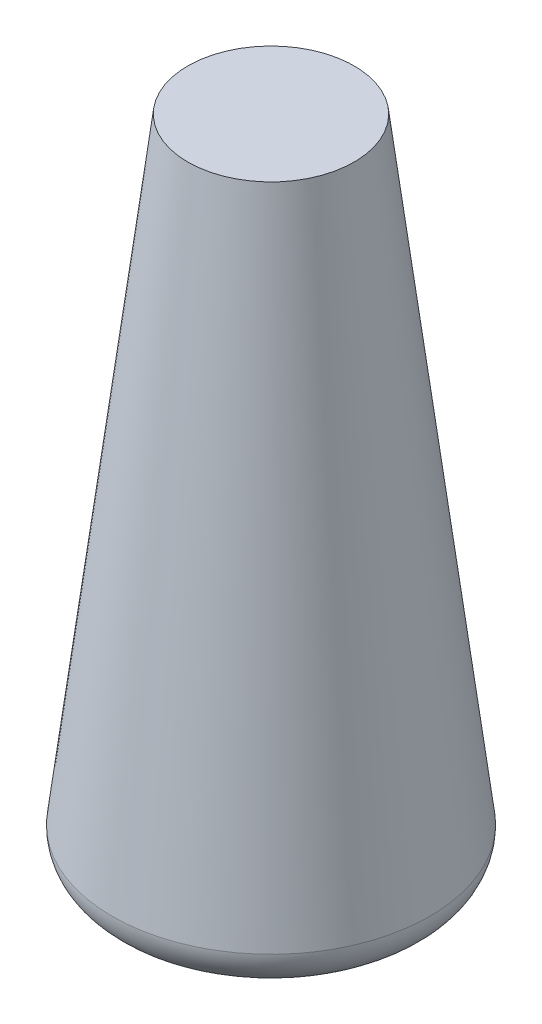
ISO-10303-21;
HEADER;
FILE_DESCRIPTION(('STEP AP214'),'2;1');
FILE_NAME('part.step','',(''),(''),'','','');
FILE_SCHEMA(('AUTOMOTIVE_DESIGN { 1 0 10303 214 1 1 1 1 }'));
ENDSEC;
DATA;
#1=APPLICATION_CONTEXT('core data for automotive mechanical design processes');
#2=APPLICATION_PROTOCOL_DEFINITION('international standard','automotive_design',2000,#1);
#3=PRODUCT_CONTEXT('',#1,'mechanical');
#4=PRODUCT('Part','Part','',(#3));
#5=PRODUCT_RELATED_PRODUCT_CATEGORY('part','',(#4));
#6=PRODUCT_DEFINITION_FORMATION('','',#4);
#7=PRODUCT_DEFINITION_CONTEXT('part definition',#1,'design');
#8=PRODUCT_DEFINITION('design','',#6,#7);
#9=PRODUCT_DEFINITION_SHAPE('','',#8);
#10=(LENGTH_UNIT() NAMED_UNIT(*) SI_UNIT(.MILLI.,.METRE.));
#11=(NAMED_UNIT(*) PLANE_ANGLE_UNIT() SI_UNIT($,.RADIAN.));
#12=(NAMED_UNIT(*) SI_UNIT($,.STERADIAN.) SOLID_ANGLE_UNIT());
#13=UNCERTAINTY_MEASURE_WITH_UNIT(LENGTH_MEASURE(1.E-05),#10,'distance_accuracy_value','');
#14=(GEOMETRIC_REPRESENTATION_CONTEXT(3) GLOBAL_UNCERTAINTY_ASSIGNED_CONTEXT((#13)) GLOBAL_UNIT_ASSIGNED_CONTEXT((#10,
#11,#12)) REPRESENTATION_CONTEXT('',''));
#15=CARTESIAN_POINT('',(0.,0.,0.));
#16=DIRECTION('',(0.,0.,1.));
#17=DIRECTION('',(1.,0.,0.));
#18=AXIS2_PLACEMENT_3D('',#15,#16,#17);
#19=CARTESIAN_POINT('',(0.,0.,0.));
#20=DIRECTION('',(0.,1.,0.));
#21=DIRECTION('',(0.,0.,1.));
#22=AXIS2_PLACEMENT_3D('',#19,#20,#21);
#23=PLANE('',#22);
#24=CARTESIAN_POINT('',(0.,0.,0.));
#25=DIRECTION('',(0.,1.,0.));
#26=DIRECTION('',(0.,0.,1.));
#27=AXIS2_PLACEMENT_3D('',#24,#25,#26);
#28=CIRCLE('',#27,30.);
#29=CARTESIAN_POINT('',(0.,0.,30.));
#30=VERTEX_POINT('',#29);
#31=EDGE_CURVE('E10',#30,#30,#28,.F.);
#32=ORIENTED_EDGE('',*,*,#31,.T.);
#33=EDGE_LOOP('',(#32));
#34=FACE_BOUND('',#33,.T.);
#35=ADVANCED_FACE('F33',(#34),#23,.F.);
#36=CARTESIAN_POINT('',(0.,10.,0.));
#37=DIRECTION('',(0.,-1.,0.));
#38=DIRECTION('',(0.,0.,1.));
#39=AXIS2_PLACEMENT_3D('',#36,#37,#38);
#40=CONICAL_SURFACE('',#39,40.,0.122173047639603);
#41=CARTESIAN_POINT('',(0.,165.,0.));
#42=DIRECTION('',(0.,1.,0.));
#43=DIRECTION('',(0.,0.,1.));
#44=AXIS2_PLACEMENT_3D('',#41,#42,#43);
#45=CIRCLE('',#44,20.9683930600498);
#46=CARTESIAN_POINT('',(0.,165.,20.9683930600498));
#47=VERTEX_POINT('',#46);
#48=EDGE_CURVE('E44',#47,#47,#45,.T.);
#49=ORIENTED_EDGE('',*,*,#48,.F.);
#50=EDGE_LOOP('',(#49));
#51=FACE_BOUND('',#50,.T.);
#52=CARTESIAN_POINT('',(0.,10.,0.));
#53=DIRECTION('',(0.,1.,0.));
#54=DIRECTION('',(0.,0.,1.));
#55=AXIS2_PLACEMENT_3D('',#52,#53,#54);
#56=CIRCLE('',#55,40.);
#57=CARTESIAN_POINT('',(0.,10.,40.));
#58=VERTEX_POINT('',#57);
#59=EDGE_CURVE('E40',#58,#58,#56,.T.);
#60=ORIENTED_EDGE('',*,*,#59,.T.);
#61=EDGE_LOOP('',(#60));
#62=FACE_BOUND('',#61,.T.);
#63=ADVANCED_FACE('F53',(#51,#62),#40,.T.);
#64=CARTESIAN_POINT('',(0.,165.,0.));
#65=DIRECTION('',(0.,1.,0.));
#66=DIRECTION('',(0.,0.,1.));
#67=AXIS2_PLACEMENT_3D('',#64,#65,#66);
#68=PLANE('',#67);
#69=ORIENTED_EDGE('',*,*,#48,.T.);
#70=EDGE_LOOP('',(#69));
#71=FACE_BOUND('',#70,.T.);
#72=ADVANCED_FACE('F51',(#71),#68,.T.);
#73=CARTESIAN_POINT('',(0.,10.,0.));
#74=DIRECTION('',(0.,1.,0.));
#75=DIRECTION('',(0.,0.,1.));
#76=AXIS2_PLACEMENT_3D('',#73,#74,#75);
#77=TOROIDAL_SURFACE('',#76,30.,10.);
#78=ORIENTED_EDGE('',*,*,#31,.F.);
#79=EDGE_LOOP('',(#78));
#80=FACE_BOUND('',#79,.T.);
#81=ORIENTED_EDGE('',*,*,#59,.F.);
#82=EDGE_LOOP('',(#81));
#83=FACE_BOUND('',#82,.T.);
#84=ADVANCED_FACE('F35',(#80,#83),#77,.T.);
#85=CLOSED_SHELL('',(#35,#63,#72,#84));
#86=MANIFOLD_SOLID_BREP('B2',#85);
#87=ADVANCED_BREP_SHAPE_REPRESENTATION('',(#18,#86),#14);
#88=SHAPE_DEFINITION_REPRESENTATION(#9,#87);
ENDSEC;
END-ISO-10303-21;
